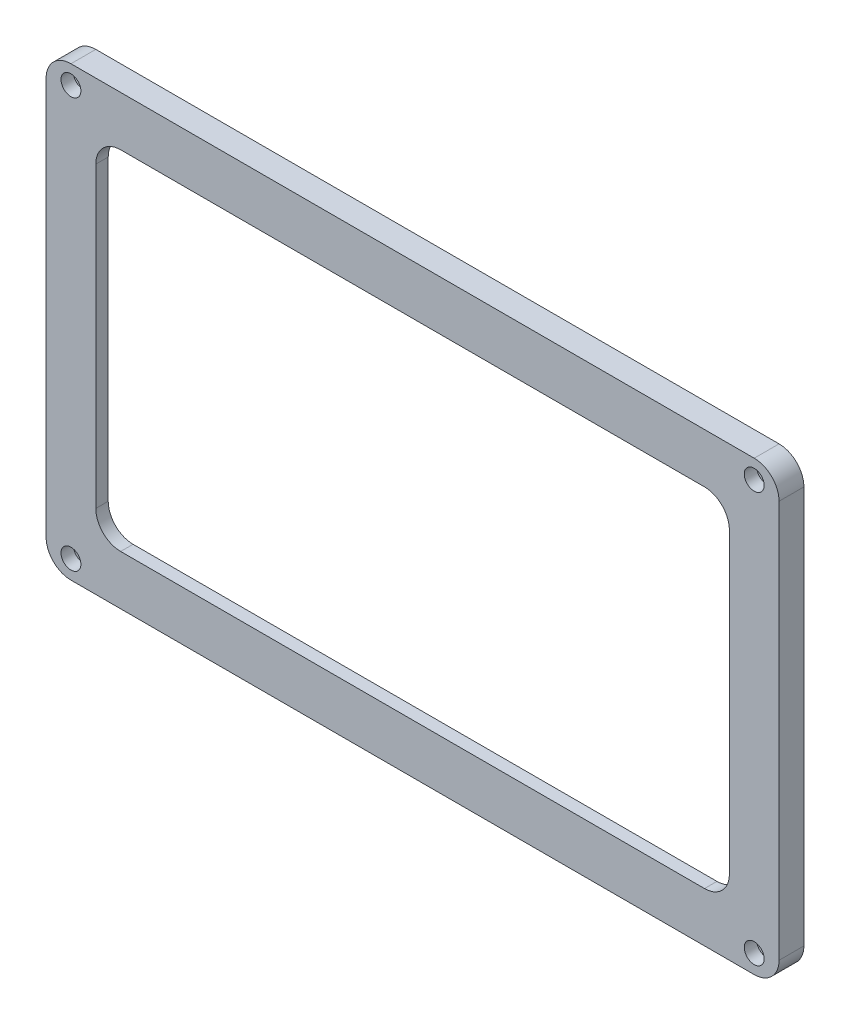
ISO-10303-21;
HEADER;
FILE_DESCRIPTION(('STEP AP214'),'2;1');
FILE_NAME('part.step','',(''),(''),'','','');
FILE_SCHEMA(('AUTOMOTIVE_DESIGN { 1 0 10303 214 1 1 1 1 }'));
ENDSEC;
DATA;
#1=APPLICATION_CONTEXT('core data for automotive mechanical design processes');
#2=APPLICATION_PROTOCOL_DEFINITION('international standard','automotive_design',2000,#1);
#3=PRODUCT_CONTEXT('',#1,'mechanical');
#4=PRODUCT('Part','Part','',(#3));
#5=PRODUCT_RELATED_PRODUCT_CATEGORY('part','',(#4));
#6=PRODUCT_DEFINITION_FORMATION('','',#4);
#7=PRODUCT_DEFINITION_CONTEXT('part definition',#1,'design');
#8=PRODUCT_DEFINITION('design','',#6,#7);
#9=PRODUCT_DEFINITION_SHAPE('','',#8);
#10=(LENGTH_UNIT() NAMED_UNIT(*) SI_UNIT(.MILLI.,.METRE.));
#11=(NAMED_UNIT(*) PLANE_ANGLE_UNIT() SI_UNIT($,.RADIAN.));
#12=(NAMED_UNIT(*) SI_UNIT($,.STERADIAN.) SOLID_ANGLE_UNIT());
#13=UNCERTAINTY_MEASURE_WITH_UNIT(LENGTH_MEASURE(1.E-05),#10,'distance_accuracy_value','');
#14=(GEOMETRIC_REPRESENTATION_CONTEXT(3) GLOBAL_UNCERTAINTY_ASSIGNED_CONTEXT((#13)) GLOBAL_UNIT_ASSIGNED_CONTEXT((#10,
#11,#12)) REPRESENTATION_CONTEXT('',''));
#15=CARTESIAN_POINT('',(0.,0.,0.));
#16=DIRECTION('',(0.,0.,1.));
#17=DIRECTION('',(1.,0.,0.));
#18=AXIS2_PLACEMENT_3D('',#15,#16,#17);
#19=CARTESIAN_POINT('',(29.5,-18.,3.));
#20=DIRECTION('',(-1.,0.,0.));
#21=DIRECTION('',(0.,0.,1.));
#22=AXIS2_PLACEMENT_3D('',#19,#20,#21);
#23=PLANE('',#22);
#24=DIRECTION('',(0.,0.,-1.));
#25=VECTOR('',#24,1.);
#26=CARTESIAN_POINT('',(29.5,-16.,3.));
#27=LINE('',#26,#25);
#28=CARTESIAN_POINT('',(29.5,-16.,3.));
#29=VERTEX_POINT('',#28);
#30=CARTESIAN_POINT('',(29.5,-16.,1.));
#31=VERTEX_POINT('',#30);
#32=EDGE_CURVE('E243',#29,#31,#27,.T.);
#33=ORIENTED_EDGE('',*,*,#32,.T.);
#34=DIRECTION('',(0.,1.,0.));
#35=VECTOR('',#34,1.);
#36=CARTESIAN_POINT('',(29.5,-18.,1.));
#37=LINE('',#36,#35);
#38=CARTESIAN_POINT('',(29.5,16.,1.));
#39=VERTEX_POINT('',#38);
#40=EDGE_CURVE('E356',#31,#39,#37,.T.);
#41=ORIENTED_EDGE('',*,*,#40,.T.);
#42=DIRECTION('',(0.,0.,-1.));
#43=VECTOR('',#42,1.);
#44=CARTESIAN_POINT('',(29.5,16.,3.));
#45=LINE('',#44,#43);
#46=CARTESIAN_POINT('',(29.5,16.,3.));
#47=VERTEX_POINT('',#46);
#48=EDGE_CURVE('E246',#39,#47,#45,.F.);
#49=ORIENTED_EDGE('',*,*,#48,.T.);
#50=DIRECTION('',(0.,1.,0.));
#51=VECTOR('',#50,1.);
#52=CARTESIAN_POINT('',(29.5,-18.,3.));
#53=LINE('',#52,#51);
#54=EDGE_CURVE('E396',#29,#47,#53,.T.);
#55=ORIENTED_EDGE('',*,*,#54,.F.);
#56=EDGE_LOOP('',(#33,#41,#49,#55));
#57=FACE_BOUND('',#56,.T.);
#58=ADVANCED_FACE('F35',(#57),#23,.F.);
#59=CARTESIAN_POINT('',(-29.5,18.,3.));
#60=DIRECTION('',(0.,-1.,0.));
#61=DIRECTION('',(0.,0.,-1.));
#62=AXIS2_PLACEMENT_3D('',#59,#60,#61);
#63=PLANE('',#62);
#64=DIRECTION('',(0.,0.,-1.));
#65=VECTOR('',#64,1.);
#66=CARTESIAN_POINT('',(27.5,18.,3.));
#67=LINE('',#66,#65);
#68=CARTESIAN_POINT('',(27.5,18.,3.));
#69=VERTEX_POINT('',#68);
#70=CARTESIAN_POINT('',(27.5,18.,1.));
#71=VERTEX_POINT('',#70);
#72=EDGE_CURVE('E225',#69,#71,#67,.T.);
#73=ORIENTED_EDGE('',*,*,#72,.T.);
#74=DIRECTION('',(-1.,0.,0.));
#75=VECTOR('',#74,1.);
#76=CARTESIAN_POINT('',(-29.5,18.,1.));
#77=LINE('',#76,#75);
#78=CARTESIAN_POINT('',(-27.5,18.,1.));
#79=VERTEX_POINT('',#78);
#80=EDGE_CURVE('E353',#71,#79,#77,.T.);
#81=ORIENTED_EDGE('',*,*,#80,.T.);
#82=DIRECTION('',(0.,0.,-1.));
#83=VECTOR('',#82,1.);
#84=CARTESIAN_POINT('',(-27.5,18.,3.));
#85=LINE('',#84,#83);
#86=CARTESIAN_POINT('',(-27.5,18.,3.));
#87=VERTEX_POINT('',#86);
#88=EDGE_CURVE('E234',#79,#87,#85,.F.);
#89=ORIENTED_EDGE('',*,*,#88,.T.);
#90=DIRECTION('',(-1.,0.,0.));
#91=VECTOR('',#90,1.);
#92=CARTESIAN_POINT('',(-29.5,18.,3.));
#93=LINE('',#92,#91);
#94=EDGE_CURVE('E399',#69,#87,#93,.T.);
#95=ORIENTED_EDGE('',*,*,#94,.F.);
#96=EDGE_LOOP('',(#73,#81,#89,#95));
#97=FACE_BOUND('',#96,.T.);
#98=ADVANCED_FACE('F465',(#97),#63,.F.);
#99=CARTESIAN_POINT('',(-29.5,-18.,3.));
#100=DIRECTION('',(1.,0.,0.));
#101=DIRECTION('',(0.,0.,-1.));
#102=AXIS2_PLACEMENT_3D('',#99,#100,#101);
#103=PLANE('',#102);
#104=DIRECTION('',(0.,0.,-1.));
#105=VECTOR('',#104,1.);
#106=CARTESIAN_POINT('',(-29.5,16.,3.));
#107=LINE('',#106,#105);
#108=CARTESIAN_POINT('',(-29.5,16.,3.));
#109=VERTEX_POINT('',#108);
#110=CARTESIAN_POINT('',(-29.5,16.,1.));
#111=VERTEX_POINT('',#110);
#112=EDGE_CURVE('E217',#109,#111,#107,.T.);
#113=ORIENTED_EDGE('',*,*,#112,.T.);
#114=DIRECTION('',(0.,-1.,0.));
#115=VECTOR('',#114,1.);
#116=CARTESIAN_POINT('',(-29.5,-18.,1.));
#117=LINE('',#116,#115);
#118=CARTESIAN_POINT('',(-29.5,-16.,1.));
#119=VERTEX_POINT('',#118);
#120=EDGE_CURVE('E199',#111,#119,#117,.T.);
#121=ORIENTED_EDGE('',*,*,#120,.T.);
#122=DIRECTION('',(0.,0.,-1.));
#123=VECTOR('',#122,1.);
#124=CARTESIAN_POINT('',(-29.5,-16.,3.));
#125=LINE('',#124,#123);
#126=CARTESIAN_POINT('',(-29.5,-16.,3.));
#127=VERTEX_POINT('',#126);
#128=EDGE_CURVE('E214',#119,#127,#125,.F.);
#129=ORIENTED_EDGE('',*,*,#128,.T.);
#130=DIRECTION('',(0.,-1.,0.));
#131=VECTOR('',#130,1.);
#132=CARTESIAN_POINT('',(-29.5,-18.,3.));
#133=LINE('',#132,#131);
#134=EDGE_CURVE('E402',#109,#127,#133,.T.);
#135=ORIENTED_EDGE('',*,*,#134,.F.);
#136=EDGE_LOOP('',(#113,#121,#129,#135));
#137=FACE_BOUND('',#136,.T.);
#138=ADVANCED_FACE('F212',(#137),#103,.F.);
#139=CARTESIAN_POINT('',(-29.5,-18.,3.));
#140=DIRECTION('',(0.,1.,0.));
#141=DIRECTION('',(0.,0.,1.));
#142=AXIS2_PLACEMENT_3D('',#139,#140,#141);
#143=PLANE('',#142);
#144=DIRECTION('',(0.,0.,-1.));
#145=VECTOR('',#144,1.);
#146=CARTESIAN_POINT('',(-27.5,-18.,3.));
#147=LINE('',#146,#145);
#148=CARTESIAN_POINT('',(-27.5,-18.,3.));
#149=VERTEX_POINT('',#148);
#150=CARTESIAN_POINT('',(-27.5,-18.,1.));
#151=VERTEX_POINT('',#150);
#152=EDGE_CURVE('E248',#149,#151,#147,.T.);
#153=ORIENTED_EDGE('',*,*,#152,.T.);
#154=DIRECTION('',(1.,0.,0.));
#155=VECTOR('',#154,1.);
#156=CARTESIAN_POINT('',(-29.5,-18.,1.));
#157=LINE('',#156,#155);
#158=CARTESIAN_POINT('',(27.5,-18.,1.));
#159=VERTEX_POINT('',#158);
#160=EDGE_CURVE('E202',#151,#159,#157,.T.);
#161=ORIENTED_EDGE('',*,*,#160,.T.);
#162=DIRECTION('',(0.,0.,-1.));
#163=VECTOR('',#162,1.);
#164=CARTESIAN_POINT('',(27.5,-18.,3.));
#165=LINE('',#164,#163);
#166=CARTESIAN_POINT('',(27.5,-18.,3.));
#167=VERTEX_POINT('',#166);
#168=EDGE_CURVE('E250',#159,#167,#165,.F.);
#169=ORIENTED_EDGE('',*,*,#168,.T.);
#170=DIRECTION('',(1.,0.,0.));
#171=VECTOR('',#170,1.);
#172=CARTESIAN_POINT('',(-29.5,-18.,3.));
#173=LINE('',#172,#171);
#174=EDGE_CURVE('E404',#149,#167,#173,.T.);
#175=ORIENTED_EDGE('',*,*,#174,.F.);
#176=EDGE_LOOP('',(#153,#161,#169,#175));
#177=FACE_BOUND('',#176,.T.);
#178=ADVANCED_FACE('F619',(#177),#143,.F.);
#179=CARTESIAN_POINT('',(0.,0.,3.));
#180=DIRECTION('',(0.,0.,-1.));
#181=DIRECTION('',(-1.,0.,0.));
#182=AXIS2_PLACEMENT_3D('',#179,#180,#181);
#183=PLANE('',#182);
#184=CARTESIAN_POINT('',(-27.5,-16.5,3.));
#185=DIRECTION('',(0.,0.,1.));
#186=DIRECTION('',(1.,0.,0.));
#187=AXIS2_PLACEMENT_3D('',#184,#185,#186);
#188=CIRCLE('',#187,0.799999999999999);
#189=CARTESIAN_POINT('',(-26.7,-16.5,3.));
#190=VERTEX_POINT('',#189);
#191=EDGE_CURVE('E329',#190,#190,#188,.T.);
#192=ORIENTED_EDGE('',*,*,#191,.F.);
#193=EDGE_LOOP('',(#192));
#194=FACE_BOUND('',#193,.T.);
#195=CARTESIAN_POINT('',(27.5,-16.5,3.));
#196=DIRECTION('',(0.,0.,1.));
#197=DIRECTION('',(1.,0.,0.));
#198=AXIS2_PLACEMENT_3D('',#195,#196,#197);
#199=CIRCLE('',#198,0.799999999999999);
#200=CARTESIAN_POINT('',(28.3,-16.5,3.));
#201=VERTEX_POINT('',#200);
#202=EDGE_CURVE('E338',#201,#201,#199,.T.);
#203=ORIENTED_EDGE('',*,*,#202,.F.);
#204=EDGE_LOOP('',(#203));
#205=FACE_BOUND('',#204,.T.);
#206=CARTESIAN_POINT('',(27.5,16.5,3.));
#207=DIRECTION('',(0.,0.,1.));
#208=DIRECTION('',(1.,0.,0.));
#209=AXIS2_PLACEMENT_3D('',#206,#207,#208);
#210=CIRCLE('',#209,0.799999999999999);
#211=CARTESIAN_POINT('',(28.3,16.5,3.));
#212=VERTEX_POINT('',#211);
#213=EDGE_CURVE('E608',#212,#212,#210,.T.);
#214=ORIENTED_EDGE('',*,*,#213,.F.);
#215=EDGE_LOOP('',(#214));
#216=FACE_BOUND('',#215,.T.);
#217=CARTESIAN_POINT('',(-27.5,16.5,3.));
#218=DIRECTION('',(0.,0.,1.));
#219=DIRECTION('',(1.,0.,0.));
#220=AXIS2_PLACEMENT_3D('',#217,#218,#219);
#221=CIRCLE('',#220,0.799999999999999);
#222=CARTESIAN_POINT('',(-26.7,16.5,3.));
#223=VERTEX_POINT('',#222);
#224=EDGE_CURVE('E345',#223,#223,#221,.T.);
#225=ORIENTED_EDGE('',*,*,#224,.F.);
#226=EDGE_LOOP('',(#225));
#227=FACE_BOUND('',#226,.T.);
#228=DIRECTION('',(-1.,0.,0.));
#229=VECTOR('',#228,1.);
#230=CARTESIAN_POINT('',(-25.5,14.,3.));
#231=LINE('',#230,#229);
#232=CARTESIAN_POINT('',(23.5,14.,3.));
#233=VERTEX_POINT('',#232);
#234=CARTESIAN_POINT('',(-23.5,14.,3.));
#235=VERTEX_POINT('',#234);
#236=EDGE_CURVE('E375',#233,#235,#231,.T.);
#237=ORIENTED_EDGE('',*,*,#236,.F.);
#238=CARTESIAN_POINT('',(23.5,12.,3.));
#239=DIRECTION('',(0.,0.,-1.));
#240=DIRECTION('',(-1.,0.,0.));
#241=AXIS2_PLACEMENT_3D('',#238,#239,#240);
#242=CIRCLE('',#241,2.);
#243=CARTESIAN_POINT('',(25.5,12.,3.));
#244=VERTEX_POINT('',#243);
#245=EDGE_CURVE('E280',#233,#244,#242,.T.);
#246=ORIENTED_EDGE('',*,*,#245,.T.);
#247=DIRECTION('',(0.,1.,0.));
#248=VECTOR('',#247,1.);
#249=CARTESIAN_POINT('',(25.5,-14.,3.));
#250=LINE('',#249,#248);
#251=CARTESIAN_POINT('',(25.5,-12.,3.));
#252=VERTEX_POINT('',#251);
#253=EDGE_CURVE('E372',#252,#244,#250,.T.);
#254=ORIENTED_EDGE('',*,*,#253,.F.);
#255=CARTESIAN_POINT('',(23.5,-12.,3.));
#256=DIRECTION('',(0.,0.,-1.));
#257=DIRECTION('',(-1.,0.,0.));
#258=AXIS2_PLACEMENT_3D('',#255,#256,#257);
#259=CIRCLE('',#258,2.);
#260=CARTESIAN_POINT('',(23.5,-14.,3.));
#261=VERTEX_POINT('',#260);
#262=EDGE_CURVE('E276',#252,#261,#259,.T.);
#263=ORIENTED_EDGE('',*,*,#262,.T.);
#264=DIRECTION('',(1.,0.,0.));
#265=VECTOR('',#264,1.);
#266=CARTESIAN_POINT('',(-25.5,-14.,3.));
#267=LINE('',#266,#265);
#268=CARTESIAN_POINT('',(-23.5,-14.,3.));
#269=VERTEX_POINT('',#268);
#270=EDGE_CURVE('E381',#269,#261,#267,.T.);
#271=ORIENTED_EDGE('',*,*,#270,.F.);
#272=CARTESIAN_POINT('',(-23.5,-12.,3.));
#273=DIRECTION('',(0.,0.,-1.));
#274=DIRECTION('',(-1.,0.,0.));
#275=AXIS2_PLACEMENT_3D('',#272,#273,#274);
#276=CIRCLE('',#275,2.);
#277=CARTESIAN_POINT('',(-25.5,-12.,3.));
#278=VERTEX_POINT('',#277);
#279=EDGE_CURVE('E272',#269,#278,#276,.T.);
#280=ORIENTED_EDGE('',*,*,#279,.T.);
#281=DIRECTION('',(0.,-1.,0.));
#282=VECTOR('',#281,1.);
#283=CARTESIAN_POINT('',(-25.5,-14.,3.));
#284=LINE('',#283,#282);
#285=CARTESIAN_POINT('',(-25.5,12.,3.));
#286=VERTEX_POINT('',#285);
#287=EDGE_CURVE('E378',#286,#278,#284,.T.);
#288=ORIENTED_EDGE('',*,*,#287,.F.);
#289=CARTESIAN_POINT('',(-23.5,12.,3.));
#290=DIRECTION('',(0.,0.,-1.));
#291=DIRECTION('',(-1.,0.,0.));
#292=AXIS2_PLACEMENT_3D('',#289,#290,#291);
#293=CIRCLE('',#292,2.);
#294=EDGE_CURVE('E284',#286,#235,#293,.T.);
#295=ORIENTED_EDGE('',*,*,#294,.T.);
#296=EDGE_LOOP('',(#237,#246,#254,#263,#271,#280,#288,#295));
#297=FACE_BOUND('',#296,.T.);
#298=ORIENTED_EDGE('',*,*,#94,.T.);
#299=CARTESIAN_POINT('',(-27.5,16.,3.));
#300=DIRECTION('',(0.,0.,-1.));
#301=DIRECTION('',(-1.,0.,0.));
#302=AXIS2_PLACEMENT_3D('',#299,#300,#301);
#303=CIRCLE('',#302,2.);
#304=EDGE_CURVE('E241',#87,#109,#303,.F.);
#305=ORIENTED_EDGE('',*,*,#304,.T.);
#306=ORIENTED_EDGE('',*,*,#134,.T.);
#307=CARTESIAN_POINT('',(-27.5,-16.,3.));
#308=DIRECTION('',(0.,0.,-1.));
#309=DIRECTION('',(-1.,0.,0.));
#310=AXIS2_PLACEMENT_3D('',#307,#308,#309);
#311=CIRCLE('',#310,2.);
#312=EDGE_CURVE('E222',#127,#149,#311,.F.);
#313=ORIENTED_EDGE('',*,*,#312,.T.);
#314=ORIENTED_EDGE('',*,*,#174,.T.);
#315=CARTESIAN_POINT('',(27.5,-16.,3.));
#316=DIRECTION('',(0.,0.,-1.));
#317=DIRECTION('',(-1.,0.,0.));
#318=AXIS2_PLACEMENT_3D('',#315,#316,#317);
#319=CIRCLE('',#318,2.);
#320=EDGE_CURVE('E237',#167,#29,#319,.F.);
#321=ORIENTED_EDGE('',*,*,#320,.T.);
#322=ORIENTED_EDGE('',*,*,#54,.T.);
#323=CARTESIAN_POINT('',(27.5,16.,3.));
#324=DIRECTION('',(0.,0.,-1.));
#325=DIRECTION('',(-1.,0.,0.));
#326=AXIS2_PLACEMENT_3D('',#323,#324,#325);
#327=CIRCLE('',#326,2.);
#328=EDGE_CURVE('E239',#47,#69,#327,.F.);
#329=ORIENTED_EDGE('',*,*,#328,.T.);
#330=EDGE_LOOP('',(#298,#305,#306,#313,#314,#321,#322,#329));
#331=FACE_BOUND('',#330,.T.);
#332=ADVANCED_FACE('F432',(#194,#205,#216,#227,#297,#331),#183,.F.);
#333=CARTESIAN_POINT('',(-26.75,-15.25,2.));
#334=DIRECTION('',(-1.,0.,0.));
#335=DIRECTION('',(0.,0.,1.));
#336=AXIS2_PLACEMENT_3D('',#333,#334,#335);
#337=PLANE('',#336);
#338=DIRECTION('',(0.,1.,0.));
#339=VECTOR('',#338,1.);
#340=CARTESIAN_POINT('',(-26.75,-15.25,1.));
#341=LINE('',#340,#339);
#342=CARTESIAN_POINT('',(-26.75,-15.05,1.));
#343=VERTEX_POINT('',#342);
#344=CARTESIAN_POINT('',(-26.75,15.05,1.));
#345=VERTEX_POINT('',#344);
#346=EDGE_CURVE('E369',#343,#345,#341,.T.);
#347=ORIENTED_EDGE('',*,*,#346,.T.);
#348=DIRECTION('',(0.,0.,-1.));
#349=VECTOR('',#348,1.);
#350=CARTESIAN_POINT('',(-26.75,15.05,2.));
#351=LINE('',#350,#349);
#352=CARTESIAN_POINT('',(-26.75,15.05,2.));
#353=VERTEX_POINT('',#352);
#354=EDGE_CURVE('E307',#345,#353,#351,.F.);
#355=ORIENTED_EDGE('',*,*,#354,.T.);
#356=DIRECTION('',(0.,1.,0.));
#357=VECTOR('',#356,1.);
#358=CARTESIAN_POINT('',(-26.75,-15.25,2.));
#359=LINE('',#358,#357);
#360=CARTESIAN_POINT('',(-26.75,-15.05,2.));
#361=VERTEX_POINT('',#360);
#362=EDGE_CURVE('E384',#361,#353,#359,.T.);
#363=ORIENTED_EDGE('',*,*,#362,.F.);
#364=DIRECTION('',(0.,0.,-1.));
#365=VECTOR('',#364,1.);
#366=CARTESIAN_POINT('',(-26.75,-15.05,1.));
#367=LINE('',#366,#365);
#368=EDGE_CURVE('E304',#361,#343,#367,.T.);
#369=ORIENTED_EDGE('',*,*,#368,.T.);
#370=EDGE_LOOP('',(#347,#355,#363,#369));
#371=FACE_BOUND('',#370,.T.);
#372=ADVANCED_FACE('F518',(#371),#337,.F.);
#373=CARTESIAN_POINT('',(26.75,-15.25,2.));
#374=DIRECTION('',(0.,-1.,0.));
#375=DIRECTION('',(0.,0.,-1.));
#376=AXIS2_PLACEMENT_3D('',#373,#374,#375);
#377=PLANE('',#376);
#378=DIRECTION('',(-1.,0.,0.));
#379=VECTOR('',#378,1.);
#380=CARTESIAN_POINT('',(26.75,-15.25,1.));
#381=LINE('',#380,#379);
#382=CARTESIAN_POINT('',(26.55,-15.25,1.));
#383=VERTEX_POINT('',#382);
#384=CARTESIAN_POINT('',(-26.55,-15.25,1.));
#385=VERTEX_POINT('',#384);
#386=EDGE_CURVE('E367',#383,#385,#381,.T.);
#387=ORIENTED_EDGE('',*,*,#386,.T.);
#388=DIRECTION('',(0.,0.,-1.));
#389=VECTOR('',#388,1.);
#390=CARTESIAN_POINT('',(-26.55,-15.25,2.));
#391=LINE('',#390,#389);
#392=CARTESIAN_POINT('',(-26.55,-15.25,2.));
#393=VERTEX_POINT('',#392);
#394=EDGE_CURVE('E311',#385,#393,#391,.F.);
#395=ORIENTED_EDGE('',*,*,#394,.T.);
#396=DIRECTION('',(-1.,0.,0.));
#397=VECTOR('',#396,1.);
#398=CARTESIAN_POINT('',(26.75,-15.25,2.));
#399=LINE('',#398,#397);
#400=CARTESIAN_POINT('',(26.55,-15.25,2.));
#401=VERTEX_POINT('',#400);
#402=EDGE_CURVE('E393',#401,#393,#399,.T.);
#403=ORIENTED_EDGE('',*,*,#402,.F.);
#404=DIRECTION('',(0.,0.,-1.));
#405=VECTOR('',#404,1.);
#406=CARTESIAN_POINT('',(26.55,-15.25,1.));
#407=LINE('',#406,#405);
#408=EDGE_CURVE('E309',#401,#383,#407,.T.);
#409=ORIENTED_EDGE('',*,*,#408,.T.);
#410=EDGE_LOOP('',(#387,#395,#403,#409));
#411=FACE_BOUND('',#410,.T.);
#412=ADVANCED_FACE('F534',(#411),#377,.F.);
#413=CARTESIAN_POINT('',(26.75,-15.25,2.));
#414=DIRECTION('',(1.,0.,0.));
#415=DIRECTION('',(0.,0.,-1.));
#416=AXIS2_PLACEMENT_3D('',#413,#414,#415);
#417=PLANE('',#416);
#418=DIRECTION('',(0.,-1.,0.));
#419=VECTOR('',#418,1.);
#420=CARTESIAN_POINT('',(26.75,-15.25,2.));
#421=LINE('',#420,#419);
#422=CARTESIAN_POINT('',(26.75,15.05,2.));
#423=VERTEX_POINT('',#422);
#424=CARTESIAN_POINT('',(26.75,-15.05,2.));
#425=VERTEX_POINT('',#424);
#426=EDGE_CURVE('E390',#423,#425,#421,.T.);
#427=ORIENTED_EDGE('',*,*,#426,.F.);
#428=DIRECTION('',(0.,0.,-1.));
#429=VECTOR('',#428,1.);
#430=CARTESIAN_POINT('',(26.75,15.05,1.));
#431=LINE('',#430,#429);
#432=CARTESIAN_POINT('',(26.75,15.05,1.));
#433=VERTEX_POINT('',#432);
#434=EDGE_CURVE('E288',#423,#433,#431,.T.);
#435=ORIENTED_EDGE('',*,*,#434,.T.);
#436=DIRECTION('',(0.,-1.,0.));
#437=VECTOR('',#436,1.);
#438=CARTESIAN_POINT('',(26.75,-15.25,1.));
#439=LINE('',#438,#437);
#440=CARTESIAN_POINT('',(26.75,-15.05,1.));
#441=VERTEX_POINT('',#440);
#442=EDGE_CURVE('E364',#433,#441,#439,.T.);
#443=ORIENTED_EDGE('',*,*,#442,.T.);
#444=DIRECTION('',(0.,0.,-1.));
#445=VECTOR('',#444,1.);
#446=CARTESIAN_POINT('',(26.75,-15.05,2.));
#447=LINE('',#446,#445);
#448=EDGE_CURVE('E207',#441,#425,#447,.F.);
#449=ORIENTED_EDGE('',*,*,#448,.T.);
#450=EDGE_LOOP('',(#427,#435,#443,#449));
#451=FACE_BOUND('',#450,.T.);
#452=ADVANCED_FACE('F531',(#451),#417,.F.);
#453=CARTESIAN_POINT('',(26.75,15.25,2.));
#454=DIRECTION('',(0.,1.,0.));
#455=DIRECTION('',(0.,0.,1.));
#456=AXIS2_PLACEMENT_3D('',#453,#454,#455);
#457=PLANE('',#456);
#458=DIRECTION('',(1.,0.,0.));
#459=VECTOR('',#458,1.);
#460=CARTESIAN_POINT('',(26.75,15.25,1.));
#461=LINE('',#460,#459);
#462=CARTESIAN_POINT('',(-26.55,15.25,1.));
#463=VERTEX_POINT('',#462);
#464=CARTESIAN_POINT('',(26.55,15.25,1.));
#465=VERTEX_POINT('',#464);
#466=EDGE_CURVE('E361',#463,#465,#461,.T.);
#467=ORIENTED_EDGE('',*,*,#466,.T.);
#468=DIRECTION('',(0.,0.,-1.));
#469=VECTOR('',#468,1.);
#470=CARTESIAN_POINT('',(26.55,15.25,2.));
#471=LINE('',#470,#469);
#472=CARTESIAN_POINT('',(26.55,15.25,2.));
#473=VERTEX_POINT('',#472);
#474=EDGE_CURVE('E294',#465,#473,#471,.F.);
#475=ORIENTED_EDGE('',*,*,#474,.T.);
#476=DIRECTION('',(1.,0.,0.));
#477=VECTOR('',#476,1.);
#478=CARTESIAN_POINT('',(26.75,15.25,2.));
#479=LINE('',#478,#477);
#480=CARTESIAN_POINT('',(-26.55,15.25,2.));
#481=VERTEX_POINT('',#480);
#482=EDGE_CURVE('E387',#481,#473,#479,.T.);
#483=ORIENTED_EDGE('',*,*,#482,.F.);
#484=DIRECTION('',(0.,0.,-1.));
#485=VECTOR('',#484,1.);
#486=CARTESIAN_POINT('',(-26.55,15.25,1.));
#487=LINE('',#486,#485);
#488=EDGE_CURVE('E291',#481,#463,#487,.T.);
#489=ORIENTED_EDGE('',*,*,#488,.T.);
#490=EDGE_LOOP('',(#467,#475,#483,#489));
#491=FACE_BOUND('',#490,.T.);
#492=ADVANCED_FACE('F524',(#491),#457,.F.);
#493=CARTESIAN_POINT('',(0.,0.,2.));
#494=DIRECTION('',(0.,0.,1.));
#495=DIRECTION('',(1.,0.,0.));
#496=AXIS2_PLACEMENT_3D('',#493,#494,#495);
#497=PLANE('',#496);
#498=DIRECTION('',(0.,-1.,0.));
#499=VECTOR('',#498,1.);
#500=CARTESIAN_POINT('',(-25.5,0.,2.));
#501=LINE('',#500,#499);
#502=CARTESIAN_POINT('',(-25.5,12.,2.));
#503=VERTEX_POINT('',#502);
#504=CARTESIAN_POINT('',(-25.5,-12.,2.));
#505=VERTEX_POINT('',#504);
#506=EDGE_CURVE('E410',#503,#505,#501,.T.);
#507=ORIENTED_EDGE('',*,*,#506,.T.);
#508=CARTESIAN_POINT('',(-23.5,-12.,2.));
#509=DIRECTION('',(0.,0.,1.));
#510=DIRECTION('',(1.,0.,0.));
#511=AXIS2_PLACEMENT_3D('',#508,#509,#510);
#512=CIRCLE('',#511,2.);
#513=CARTESIAN_POINT('',(-23.5,-14.,2.));
#514=VERTEX_POINT('',#513);
#515=EDGE_CURVE('E274',#505,#514,#512,.T.);
#516=ORIENTED_EDGE('',*,*,#515,.T.);
#517=DIRECTION('',(1.,0.,0.));
#518=VECTOR('',#517,1.);
#519=CARTESIAN_POINT('',(0.,-14.,2.));
#520=LINE('',#519,#518);
#521=CARTESIAN_POINT('',(23.5,-14.,2.));
#522=VERTEX_POINT('',#521);
#523=EDGE_CURVE('E228',#514,#522,#520,.T.);
#524=ORIENTED_EDGE('',*,*,#523,.T.);
#525=CARTESIAN_POINT('',(23.5,-12.,2.));
#526=DIRECTION('',(0.,0.,1.));
#527=DIRECTION('',(1.,0.,0.));
#528=AXIS2_PLACEMENT_3D('',#525,#526,#527);
#529=CIRCLE('',#528,2.);
#530=CARTESIAN_POINT('',(25.5,-12.,2.));
#531=VERTEX_POINT('',#530);
#532=EDGE_CURVE('E278',#522,#531,#529,.T.);
#533=ORIENTED_EDGE('',*,*,#532,.T.);
#534=DIRECTION('',(0.,1.,0.));
#535=VECTOR('',#534,1.);
#536=CARTESIAN_POINT('',(25.5,0.,2.));
#537=LINE('',#536,#535);
#538=CARTESIAN_POINT('',(25.5,12.,2.));
#539=VERTEX_POINT('',#538);
#540=EDGE_CURVE('E223',#531,#539,#537,.T.);
#541=ORIENTED_EDGE('',*,*,#540,.T.);
#542=CARTESIAN_POINT('',(23.5,12.,2.));
#543=DIRECTION('',(0.,0.,1.));
#544=DIRECTION('',(1.,0.,0.));
#545=AXIS2_PLACEMENT_3D('',#542,#543,#544);
#546=CIRCLE('',#545,2.);
#547=CARTESIAN_POINT('',(23.5,14.,2.));
#548=VERTEX_POINT('',#547);
#549=EDGE_CURVE('E282',#539,#548,#546,.T.);
#550=ORIENTED_EDGE('',*,*,#549,.T.);
#551=DIRECTION('',(-1.,0.,0.));
#552=VECTOR('',#551,1.);
#553=CARTESIAN_POINT('',(0.,14.,2.));
#554=LINE('',#553,#552);
#555=CARTESIAN_POINT('',(-23.5,14.,2.));
#556=VERTEX_POINT('',#555);
#557=EDGE_CURVE('E407',#548,#556,#554,.T.);
#558=ORIENTED_EDGE('',*,*,#557,.T.);
#559=CARTESIAN_POINT('',(-23.5,12.,2.));
#560=DIRECTION('',(0.,0.,1.));
#561=DIRECTION('',(1.,0.,0.));
#562=AXIS2_PLACEMENT_3D('',#559,#560,#561);
#563=CIRCLE('',#562,2.);
#564=EDGE_CURVE('E208',#556,#503,#563,.T.);
#565=ORIENTED_EDGE('',*,*,#564,.T.);
#566=EDGE_LOOP('',(#507,#516,#524,#533,#541,#550,#558,#565));
#567=FACE_BOUND('',#566,.T.);
#568=ORIENTED_EDGE('',*,*,#482,.T.);
#569=CARTESIAN_POINT('',(26.55,15.05,2.));
#570=DIRECTION('',(0.,0.,1.));
#571=DIRECTION('',(1.,0.,0.));
#572=AXIS2_PLACEMENT_3D('',#569,#570,#571);
#573=CIRCLE('',#572,0.2);
#574=EDGE_CURVE('E302',#473,#423,#573,.F.);
#575=ORIENTED_EDGE('',*,*,#574,.T.);
#576=ORIENTED_EDGE('',*,*,#426,.T.);
#577=CARTESIAN_POINT('',(26.55,-15.05,2.));
#578=DIRECTION('',(0.,0.,1.));
#579=DIRECTION('',(1.,0.,0.));
#580=AXIS2_PLACEMENT_3D('',#577,#578,#579);
#581=CIRCLE('',#580,0.2);
#582=EDGE_CURVE('E296',#425,#401,#581,.F.);
#583=ORIENTED_EDGE('',*,*,#582,.T.);
#584=ORIENTED_EDGE('',*,*,#402,.T.);
#585=CARTESIAN_POINT('',(-26.55,-15.05,2.));
#586=DIRECTION('',(0.,0.,1.));
#587=DIRECTION('',(1.,0.,0.));
#588=AXIS2_PLACEMENT_3D('',#585,#586,#587);
#589=CIRCLE('',#588,0.2);
#590=EDGE_CURVE('E298',#393,#361,#589,.F.);
#591=ORIENTED_EDGE('',*,*,#590,.T.);
#592=ORIENTED_EDGE('',*,*,#362,.T.);
#593=CARTESIAN_POINT('',(-26.55,15.05,2.));
#594=DIRECTION('',(0.,0.,1.));
#595=DIRECTION('',(1.,0.,0.));
#596=AXIS2_PLACEMENT_3D('',#593,#594,#595);
#597=CIRCLE('',#596,0.2);
#598=EDGE_CURVE('E300',#353,#481,#597,.F.);
#599=ORIENTED_EDGE('',*,*,#598,.T.);
#600=EDGE_LOOP('',(#568,#575,#576,#583,#584,#591,#592,#599));
#601=FACE_BOUND('',#600,.T.);
#602=ADVANCED_FACE('F416',(#567,#601),#497,.F.);
#603=CARTESIAN_POINT('',(25.5,-14.,1.));
#604=DIRECTION('',(1.,0.,0.));
#605=DIRECTION('',(0.,0.,-1.));
#606=AXIS2_PLACEMENT_3D('',#603,#604,#605);
#607=PLANE('',#606);
#608=ORIENTED_EDGE('',*,*,#540,.F.);
#609=DIRECTION('',(0.,0.,1.));
#610=VECTOR('',#609,1.);
#611=CARTESIAN_POINT('',(25.5,-12.,3.));
#612=LINE('',#611,#610);
#613=EDGE_CURVE('E264',#531,#252,#612,.T.);
#614=ORIENTED_EDGE('',*,*,#613,.T.);
#615=ORIENTED_EDGE('',*,*,#253,.T.);
#616=DIRECTION('',(0.,0.,1.));
#617=VECTOR('',#616,1.);
#618=CARTESIAN_POINT('',(25.5,12.,2.));
#619=LINE('',#618,#617);
#620=EDGE_CURVE('E262',#244,#539,#619,.F.);
#621=ORIENTED_EDGE('',*,*,#620,.T.);
#622=EDGE_LOOP('',(#608,#614,#615,#621));
#623=FACE_BOUND('',#622,.T.);
#624=ADVANCED_FACE('F428',(#623),#607,.F.);
#625=CARTESIAN_POINT('',(-25.5,-14.,1.));
#626=DIRECTION('',(0.,-1.,0.));
#627=DIRECTION('',(0.,0.,-1.));
#628=AXIS2_PLACEMENT_3D('',#625,#626,#627);
#629=PLANE('',#628);
#630=ORIENTED_EDGE('',*,*,#523,.F.);
#631=DIRECTION('',(0.,0.,1.));
#632=VECTOR('',#631,1.);
#633=CARTESIAN_POINT('',(-23.5,-14.,3.));
#634=LINE('',#633,#632);
#635=EDGE_CURVE('E254',#514,#269,#634,.T.);
#636=ORIENTED_EDGE('',*,*,#635,.T.);
#637=ORIENTED_EDGE('',*,*,#270,.T.);
#638=DIRECTION('',(0.,0.,1.));
#639=VECTOR('',#638,1.);
#640=CARTESIAN_POINT('',(23.5,-14.,2.));
#641=LINE('',#640,#639);
#642=EDGE_CURVE('E252',#261,#522,#641,.F.);
#643=ORIENTED_EDGE('',*,*,#642,.T.);
#644=EDGE_LOOP('',(#630,#636,#637,#643));
#645=FACE_BOUND('',#644,.T.);
#646=ADVANCED_FACE('F454',(#645),#629,.F.);
#647=CARTESIAN_POINT('',(-25.5,-14.,1.));
#648=DIRECTION('',(-1.,0.,0.));
#649=DIRECTION('',(0.,0.,1.));
#650=AXIS2_PLACEMENT_3D('',#647,#648,#649);
#651=PLANE('',#650);
#652=ORIENTED_EDGE('',*,*,#287,.T.);
#653=DIRECTION('',(0.,0.,1.));
#654=VECTOR('',#653,1.);
#655=CARTESIAN_POINT('',(-25.5,-12.,2.));
#656=LINE('',#655,#654);
#657=EDGE_CURVE('E260',#278,#505,#656,.F.);
#658=ORIENTED_EDGE('',*,*,#657,.T.);
#659=ORIENTED_EDGE('',*,*,#506,.F.);
#660=DIRECTION('',(0.,0.,1.));
#661=VECTOR('',#660,1.);
#662=CARTESIAN_POINT('',(-25.5,12.,3.));
#663=LINE('',#662,#661);
#664=EDGE_CURVE('E257',#503,#286,#663,.T.);
#665=ORIENTED_EDGE('',*,*,#664,.T.);
#666=EDGE_LOOP('',(#652,#658,#659,#665));
#667=FACE_BOUND('',#666,.T.);
#668=ADVANCED_FACE('F450',(#667),#651,.F.);
#669=CARTESIAN_POINT('',(-25.5,14.,1.));
#670=DIRECTION('',(0.,1.,0.));
#671=DIRECTION('',(0.,0.,1.));
#672=AXIS2_PLACEMENT_3D('',#669,#670,#671);
#673=PLANE('',#672);
#674=ORIENTED_EDGE('',*,*,#557,.F.);
#675=DIRECTION('',(0.,0.,1.));
#676=VECTOR('',#675,1.);
#677=CARTESIAN_POINT('',(23.5,14.,3.));
#678=LINE('',#677,#676);
#679=EDGE_CURVE('E269',#548,#233,#678,.T.);
#680=ORIENTED_EDGE('',*,*,#679,.T.);
#681=ORIENTED_EDGE('',*,*,#236,.T.);
#682=DIRECTION('',(0.,0.,1.));
#683=VECTOR('',#682,1.);
#684=CARTESIAN_POINT('',(-23.5,14.,2.));
#685=LINE('',#684,#683);
#686=EDGE_CURVE('E267',#235,#556,#685,.F.);
#687=ORIENTED_EDGE('',*,*,#686,.T.);
#688=EDGE_LOOP('',(#674,#680,#681,#687));
#689=FACE_BOUND('',#688,.T.);
#690=ADVANCED_FACE('F441',(#689),#673,.F.);
#691=CARTESIAN_POINT('',(-27.5,16.,3.));
#692=DIRECTION('',(0.,0.,-1.));
#693=DIRECTION('',(-1.,0.,0.));
#694=AXIS2_PLACEMENT_3D('',#691,#692,#693);
#695=CYLINDRICAL_SURFACE('',#694,2.);
#696=CARTESIAN_POINT('',(-27.5,16.,1.));
#697=DIRECTION('',(0.,0.,1.));
#698=DIRECTION('',(1.,0.,0.));
#699=AXIS2_PLACEMENT_3D('',#696,#697,#698);
#700=CIRCLE('',#699,2.);
#701=EDGE_CURVE('E351',#111,#79,#700,.F.);
#702=ORIENTED_EDGE('',*,*,#701,.F.);
#703=ORIENTED_EDGE('',*,*,#112,.F.);
#704=ORIENTED_EDGE('',*,*,#304,.F.);
#705=ORIENTED_EDGE('',*,*,#88,.F.);
#706=EDGE_LOOP('',(#702,#703,#704,#705));
#707=FACE_BOUND('',#706,.T.);
#708=ADVANCED_FACE('F475',(#707),#695,.T.);
#709=CARTESIAN_POINT('',(27.5,16.,3.));
#710=DIRECTION('',(0.,0.,-1.));
#711=DIRECTION('',(-1.,0.,0.));
#712=AXIS2_PLACEMENT_3D('',#709,#710,#711);
#713=CYLINDRICAL_SURFACE('',#712,2.);
#714=CARTESIAN_POINT('',(27.5,16.,1.));
#715=DIRECTION('',(0.,0.,1.));
#716=DIRECTION('',(1.,0.,0.));
#717=AXIS2_PLACEMENT_3D('',#714,#715,#716);
#718=CIRCLE('',#717,2.);
#719=EDGE_CURVE('E359',#71,#39,#718,.F.);
#720=ORIENTED_EDGE('',*,*,#719,.F.);
#721=ORIENTED_EDGE('',*,*,#72,.F.);
#722=ORIENTED_EDGE('',*,*,#328,.F.);
#723=ORIENTED_EDGE('',*,*,#48,.F.);
#724=EDGE_LOOP('',(#720,#721,#722,#723));
#725=FACE_BOUND('',#724,.T.);
#726=ADVANCED_FACE('F478',(#725),#713,.T.);
#727=CARTESIAN_POINT('',(27.5,-16.,3.));
#728=DIRECTION('',(0.,0.,-1.));
#729=DIRECTION('',(-1.,0.,0.));
#730=AXIS2_PLACEMENT_3D('',#727,#728,#729);
#731=CYLINDRICAL_SURFACE('',#730,2.);
#732=CARTESIAN_POINT('',(27.5,-16.,1.));
#733=DIRECTION('',(0.,0.,1.));
#734=DIRECTION('',(1.,0.,0.));
#735=AXIS2_PLACEMENT_3D('',#732,#733,#734);
#736=CIRCLE('',#735,2.);
#737=EDGE_CURVE('E218',#31,#159,#736,.F.);
#738=ORIENTED_EDGE('',*,*,#737,.F.);
#739=ORIENTED_EDGE('',*,*,#32,.F.);
#740=ORIENTED_EDGE('',*,*,#320,.F.);
#741=ORIENTED_EDGE('',*,*,#168,.F.);
#742=EDGE_LOOP('',(#738,#739,#740,#741));
#743=FACE_BOUND('',#742,.T.);
#744=ADVANCED_FACE('F482',(#743),#731,.T.);
#745=CARTESIAN_POINT('',(-27.5,-16.,3.));
#746=DIRECTION('',(0.,0.,-1.));
#747=DIRECTION('',(-1.,0.,0.));
#748=AXIS2_PLACEMENT_3D('',#745,#746,#747);
#749=CYLINDRICAL_SURFACE('',#748,2.);
#750=CARTESIAN_POINT('',(-27.5,-16.,1.));
#751=DIRECTION('',(0.,0.,1.));
#752=DIRECTION('',(1.,0.,0.));
#753=AXIS2_PLACEMENT_3D('',#750,#751,#752);
#754=CIRCLE('',#753,2.);
#755=EDGE_CURVE('E196',#151,#119,#754,.F.);
#756=ORIENTED_EDGE('',*,*,#755,.F.);
#757=ORIENTED_EDGE('',*,*,#152,.F.);
#758=ORIENTED_EDGE('',*,*,#312,.F.);
#759=ORIENTED_EDGE('',*,*,#128,.F.);
#760=EDGE_LOOP('',(#756,#757,#758,#759));
#761=FACE_BOUND('',#760,.T.);
#762=ADVANCED_FACE('F221',(#761),#749,.T.);
#763=CARTESIAN_POINT('',(-23.5,-12.,1.));
#764=DIRECTION('',(0.,0.,-1.));
#765=DIRECTION('',(-1.,0.,0.));
#766=AXIS2_PLACEMENT_3D('',#763,#764,#765);
#767=CYLINDRICAL_SURFACE('',#766,2.);
#768=ORIENTED_EDGE('',*,*,#515,.F.);
#769=ORIENTED_EDGE('',*,*,#657,.F.);
#770=ORIENTED_EDGE('',*,*,#279,.F.);
#771=ORIENTED_EDGE('',*,*,#635,.F.);
#772=EDGE_LOOP('',(#768,#769,#770,#771));
#773=FACE_BOUND('',#772,.T.);
#774=ADVANCED_FACE('F453',(#773),#767,.F.);
#775=CARTESIAN_POINT('',(23.5,-12.,1.));
#776=DIRECTION('',(0.,0.,-1.));
#777=DIRECTION('',(-1.,0.,0.));
#778=AXIS2_PLACEMENT_3D('',#775,#776,#777);
#779=CYLINDRICAL_SURFACE('',#778,2.);
#780=ORIENTED_EDGE('',*,*,#532,.F.);
#781=ORIENTED_EDGE('',*,*,#642,.F.);
#782=ORIENTED_EDGE('',*,*,#262,.F.);
#783=ORIENTED_EDGE('',*,*,#613,.F.);
#784=EDGE_LOOP('',(#780,#781,#782,#783));
#785=FACE_BOUND('',#784,.T.);
#786=ADVANCED_FACE('F425',(#785),#779,.F.);
#787=CARTESIAN_POINT('',(23.5,12.,1.));
#788=DIRECTION('',(0.,0.,-1.));
#789=DIRECTION('',(-1.,0.,0.));
#790=AXIS2_PLACEMENT_3D('',#787,#788,#789);
#791=CYLINDRICAL_SURFACE('',#790,2.);
#792=ORIENTED_EDGE('',*,*,#549,.F.);
#793=ORIENTED_EDGE('',*,*,#620,.F.);
#794=ORIENTED_EDGE('',*,*,#245,.F.);
#795=ORIENTED_EDGE('',*,*,#679,.F.);
#796=EDGE_LOOP('',(#792,#793,#794,#795));
#797=FACE_BOUND('',#796,.T.);
#798=ADVANCED_FACE('F438',(#797),#791,.F.);
#799=CARTESIAN_POINT('',(-23.5,12.,1.));
#800=DIRECTION('',(0.,0.,-1.));
#801=DIRECTION('',(-1.,0.,0.));
#802=AXIS2_PLACEMENT_3D('',#799,#800,#801);
#803=CYLINDRICAL_SURFACE('',#802,2.);
#804=ORIENTED_EDGE('',*,*,#564,.F.);
#805=ORIENTED_EDGE('',*,*,#686,.F.);
#806=ORIENTED_EDGE('',*,*,#294,.F.);
#807=ORIENTED_EDGE('',*,*,#664,.F.);
#808=EDGE_LOOP('',(#804,#805,#806,#807));
#809=FACE_BOUND('',#808,.T.);
#810=ADVANCED_FACE('F447',(#809),#803,.F.);
#811=CARTESIAN_POINT('',(0.,0.,1.));
#812=DIRECTION('',(0.,0.,1.));
#813=DIRECTION('',(1.,0.,0.));
#814=AXIS2_PLACEMENT_3D('',#811,#812,#813);
#815=PLANE('',#814);
#816=CARTESIAN_POINT('',(-27.5,-16.5,1.));
#817=DIRECTION('',(0.,0.,1.));
#818=DIRECTION('',(1.,0.,0.));
#819=AXIS2_PLACEMENT_3D('',#816,#817,#818);
#820=CIRCLE('',#819,0.6);
#821=CARTESIAN_POINT('',(-26.9,-16.5,1.));
#822=VERTEX_POINT('',#821);
#823=EDGE_CURVE('E39',#822,#822,#820,.T.);
#824=ORIENTED_EDGE('',*,*,#823,.T.);
#825=EDGE_LOOP('',(#824));
#826=FACE_BOUND('',#825,.T.);
#827=CARTESIAN_POINT('',(27.5,-16.5,1.));
#828=DIRECTION('',(0.,0.,1.));
#829=DIRECTION('',(1.,0.,0.));
#830=AXIS2_PLACEMENT_3D('',#827,#828,#829);
#831=CIRCLE('',#830,0.6);
#832=CARTESIAN_POINT('',(28.1,-16.5,1.));
#833=VERTEX_POINT('',#832);
#834=EDGE_CURVE('E324',#833,#833,#831,.T.);
#835=ORIENTED_EDGE('',*,*,#834,.T.);
#836=EDGE_LOOP('',(#835));
#837=FACE_BOUND('',#836,.T.);
#838=CARTESIAN_POINT('',(27.5,16.5,1.));
#839=DIRECTION('',(0.,0.,1.));
#840=DIRECTION('',(1.,0.,0.));
#841=AXIS2_PLACEMENT_3D('',#838,#839,#840);
#842=CIRCLE('',#841,0.6);
#843=CARTESIAN_POINT('',(28.1,16.5,1.));
#844=VERTEX_POINT('',#843);
#845=EDGE_CURVE('E321',#844,#844,#842,.T.);
#846=ORIENTED_EDGE('',*,*,#845,.T.);
#847=EDGE_LOOP('',(#846));
#848=FACE_BOUND('',#847,.T.);
#849=CARTESIAN_POINT('',(-27.5,16.5,1.));
#850=DIRECTION('',(0.,0.,1.));
#851=DIRECTION('',(1.,0.,0.));
#852=AXIS2_PLACEMENT_3D('',#849,#850,#851);
#853=CIRCLE('',#852,0.6);
#854=CARTESIAN_POINT('',(-26.9,16.5,1.));
#855=VERTEX_POINT('',#854);
#856=EDGE_CURVE('E318',#855,#855,#853,.T.);
#857=ORIENTED_EDGE('',*,*,#856,.T.);
#858=EDGE_LOOP('',(#857));
#859=FACE_BOUND('',#858,.T.);
#860=ORIENTED_EDGE('',*,*,#719,.T.);
#861=ORIENTED_EDGE('',*,*,#40,.F.);
#862=ORIENTED_EDGE('',*,*,#737,.T.);
#863=ORIENTED_EDGE('',*,*,#160,.F.);
#864=ORIENTED_EDGE('',*,*,#755,.T.);
#865=ORIENTED_EDGE('',*,*,#120,.F.);
#866=ORIENTED_EDGE('',*,*,#701,.T.);
#867=ORIENTED_EDGE('',*,*,#80,.F.);
#868=EDGE_LOOP('',(#860,#861,#862,#863,#864,#865,#866,#867));
#869=FACE_BOUND('',#868,.T.);
#870=ORIENTED_EDGE('',*,*,#386,.F.);
#871=CARTESIAN_POINT('',(26.55,-15.05,1.));
#872=DIRECTION('',(0.,0.,1.));
#873=DIRECTION('',(1.,0.,0.));
#874=AXIS2_PLACEMENT_3D('',#871,#872,#873);
#875=CIRCLE('',#874,0.2);
#876=EDGE_CURVE('E11',#383,#441,#875,.T.);
#877=ORIENTED_EDGE('',*,*,#876,.T.);
#878=ORIENTED_EDGE('',*,*,#442,.F.);
#879=CARTESIAN_POINT('',(26.55,15.05,1.));
#880=DIRECTION('',(0.,0.,1.));
#881=DIRECTION('',(1.,0.,0.));
#882=AXIS2_PLACEMENT_3D('',#879,#880,#881);
#883=CIRCLE('',#882,0.2);
#884=EDGE_CURVE('E313',#433,#465,#883,.T.);
#885=ORIENTED_EDGE('',*,*,#884,.T.);
#886=ORIENTED_EDGE('',*,*,#466,.F.);
#887=CARTESIAN_POINT('',(-26.55,15.05,1.));
#888=DIRECTION('',(0.,0.,1.));
#889=DIRECTION('',(1.,0.,0.));
#890=AXIS2_PLACEMENT_3D('',#887,#888,#889);
#891=CIRCLE('',#890,0.2);
#892=EDGE_CURVE('E315',#463,#345,#891,.T.);
#893=ORIENTED_EDGE('',*,*,#892,.T.);
#894=ORIENTED_EDGE('',*,*,#346,.F.);
#895=CARTESIAN_POINT('',(-26.55,-15.05,1.));
#896=DIRECTION('',(0.,0.,1.));
#897=DIRECTION('',(1.,0.,0.));
#898=AXIS2_PLACEMENT_3D('',#895,#896,#897);
#899=CIRCLE('',#898,0.2);
#900=EDGE_CURVE('E44',#343,#385,#899,.T.);
#901=ORIENTED_EDGE('',*,*,#900,.T.);
#902=EDGE_LOOP('',(#870,#877,#878,#885,#886,#893,#894,#901));
#903=FACE_BOUND('',#902,.T.);
#904=ADVANCED_FACE('F198',(#826,#837,#848,#859,#869,#903),#815,.F.);
#905=CARTESIAN_POINT('',(26.55,15.05,2.));
#906=DIRECTION('',(0.,0.,1.));
#907=DIRECTION('',(1.,0.,0.));
#908=AXIS2_PLACEMENT_3D('',#905,#906,#907);
#909=CYLINDRICAL_SURFACE('',#908,0.2);
#910=ORIENTED_EDGE('',*,*,#574,.F.);
#911=ORIENTED_EDGE('',*,*,#474,.F.);
#912=ORIENTED_EDGE('',*,*,#884,.F.);
#913=ORIENTED_EDGE('',*,*,#434,.F.);
#914=EDGE_LOOP('',(#910,#911,#912,#913));
#915=FACE_BOUND('',#914,.T.);
#916=ADVANCED_FACE('F497',(#915),#909,.F.);
#917=CARTESIAN_POINT('',(-26.55,15.05,2.));
#918=DIRECTION('',(0.,0.,1.));
#919=DIRECTION('',(1.,0.,0.));
#920=AXIS2_PLACEMENT_3D('',#917,#918,#919);
#921=CYLINDRICAL_SURFACE('',#920,0.2);
#922=ORIENTED_EDGE('',*,*,#598,.F.);
#923=ORIENTED_EDGE('',*,*,#354,.F.);
#924=ORIENTED_EDGE('',*,*,#892,.F.);
#925=ORIENTED_EDGE('',*,*,#488,.F.);
#926=EDGE_LOOP('',(#922,#923,#924,#925));
#927=FACE_BOUND('',#926,.T.);
#928=ADVANCED_FACE('F500',(#927),#921,.F.);
#929=CARTESIAN_POINT('',(-26.55,-15.05,2.));
#930=DIRECTION('',(0.,0.,1.));
#931=DIRECTION('',(1.,0.,0.));
#932=AXIS2_PLACEMENT_3D('',#929,#930,#931);
#933=CYLINDRICAL_SURFACE('',#932,0.2);
#934=ORIENTED_EDGE('',*,*,#590,.F.);
#935=ORIENTED_EDGE('',*,*,#394,.F.);
#936=ORIENTED_EDGE('',*,*,#900,.F.);
#937=ORIENTED_EDGE('',*,*,#368,.F.);
#938=EDGE_LOOP('',(#934,#935,#936,#937));
#939=FACE_BOUND('',#938,.T.);
#940=ADVANCED_FACE('F503',(#939),#933,.F.);
#941=CARTESIAN_POINT('',(26.55,-15.05,2.));
#942=DIRECTION('',(0.,0.,1.));
#943=DIRECTION('',(1.,0.,0.));
#944=AXIS2_PLACEMENT_3D('',#941,#942,#943);
#945=CYLINDRICAL_SURFACE('',#944,0.2);
#946=ORIENTED_EDGE('',*,*,#582,.F.);
#947=ORIENTED_EDGE('',*,*,#448,.F.);
#948=ORIENTED_EDGE('',*,*,#876,.F.);
#949=ORIENTED_EDGE('',*,*,#408,.F.);
#950=EDGE_LOOP('',(#946,#947,#948,#949));
#951=FACE_BOUND('',#950,.T.);
#952=ADVANCED_FACE('F37',(#951),#945,.F.);
#953=CARTESIAN_POINT('',(-27.5,16.5,2.));
#954=DIRECTION('',(0.,0.,1.));
#955=DIRECTION('',(1.,0.,0.));
#956=AXIS2_PLACEMENT_3D('',#953,#954,#955);
#957=CYLINDRICAL_SURFACE('',#956,0.799999999999999);
#958=CARTESIAN_POINT('',(-27.5,16.5,2.));
#959=DIRECTION('',(0.,0.,1.));
#960=DIRECTION('',(1.,0.,0.));
#961=AXIS2_PLACEMENT_3D('',#958,#959,#960);
#962=CIRCLE('',#961,0.799999999999999);
#963=CARTESIAN_POINT('',(-26.7,16.5,2.));
#964=VERTEX_POINT('',#963);
#965=EDGE_CURVE('E342',#964,#964,#962,.T.);
#966=ORIENTED_EDGE('',*,*,#965,.F.);
#967=EDGE_LOOP('',(#966));
#968=FACE_BOUND('',#967,.T.);
#969=ORIENTED_EDGE('',*,*,#224,.T.);
#970=EDGE_LOOP('',(#969));
#971=FACE_BOUND('',#970,.T.);
#972=ADVANCED_FACE('F510',(#968,#971),#957,.F.);
#973=CARTESIAN_POINT('',(-27.5,16.5,2.));
#974=DIRECTION('',(0.,0.,1.));
#975=DIRECTION('',(1.,0.,0.));
#976=AXIS2_PLACEMENT_3D('',#973,#974,#975);
#977=PLANE('',#976);
#978=CARTESIAN_POINT('',(-27.5,16.5,2.));
#979=DIRECTION('',(0.,0.,1.));
#980=DIRECTION('',(1.,0.,0.));
#981=AXIS2_PLACEMENT_3D('',#978,#979,#980);
#982=CIRCLE('',#981,0.6);
#983=CARTESIAN_POINT('',(-26.9,16.5,2.));
#984=VERTEX_POINT('',#983);
#985=EDGE_CURVE('E322',#984,#984,#982,.T.);
#986=ORIENTED_EDGE('',*,*,#985,.F.);
#987=EDGE_LOOP('',(#986));
#988=FACE_BOUND('',#987,.T.);
#989=ORIENTED_EDGE('',*,*,#965,.T.);
#990=EDGE_LOOP('',(#989));
#991=FACE_BOUND('',#990,.T.);
#992=ADVANCED_FACE('F541',(#988,#991),#977,.T.);
#993=CARTESIAN_POINT('',(27.5,16.5,2.));
#994=DIRECTION('',(0.,0.,1.));
#995=DIRECTION('',(1.,0.,0.));
#996=AXIS2_PLACEMENT_3D('',#993,#994,#995);
#997=CYLINDRICAL_SURFACE('',#996,0.799999999999999);
#998=CARTESIAN_POINT('',(27.5,16.5,2.));
#999=DIRECTION('',(0.,0.,1.));
#1000=DIRECTION('',(1.,0.,0.));
#1001=AXIS2_PLACEMENT_3D('',#998,#999,#1000);
#1002=CIRCLE('',#1001,0.799999999999999);
#1003=CARTESIAN_POINT('',(28.3,16.5,2.));
#1004=VERTEX_POINT('',#1003);
#1005=EDGE_CURVE('E348',#1004,#1004,#1002,.T.);
#1006=ORIENTED_EDGE('',*,*,#1005,.F.);
#1007=EDGE_LOOP('',(#1006));
#1008=FACE_BOUND('',#1007,.T.);
#1009=ORIENTED_EDGE('',*,*,#213,.T.);
#1010=EDGE_LOOP('',(#1009));
#1011=FACE_BOUND('',#1010,.T.);
#1012=ADVANCED_FACE('F545',(#1008,#1011),#997,.F.);
#1013=CARTESIAN_POINT('',(27.5,16.5,2.));
#1014=DIRECTION('',(0.,0.,1.));
#1015=DIRECTION('',(1.,0.,0.));
#1016=AXIS2_PLACEMENT_3D('',#1013,#1014,#1015);
#1017=PLANE('',#1016);
#1018=CARTESIAN_POINT('',(27.5,16.5,2.));
#1019=DIRECTION('',(0.,0.,1.));
#1020=DIRECTION('',(1.,0.,0.));
#1021=AXIS2_PLACEMENT_3D('',#1018,#1019,#1020);
#1022=CIRCLE('',#1021,0.6);
#1023=CARTESIAN_POINT('',(28.1,16.5,2.));
#1024=VERTEX_POINT('',#1023);
#1025=EDGE_CURVE('E590',#1024,#1024,#1022,.T.);
#1026=ORIENTED_EDGE('',*,*,#1025,.F.);
#1027=EDGE_LOOP('',(#1026));
#1028=FACE_BOUND('',#1027,.T.);
#1029=ORIENTED_EDGE('',*,*,#1005,.T.);
#1030=EDGE_LOOP('',(#1029));
#1031=FACE_BOUND('',#1030,.T.);
#1032=ADVANCED_FACE('F560',(#1028,#1031),#1017,.T.);
#1033=CARTESIAN_POINT('',(27.5,-16.5,2.));
#1034=DIRECTION('',(0.,0.,1.));
#1035=DIRECTION('',(1.,0.,0.));
#1036=AXIS2_PLACEMENT_3D('',#1033,#1034,#1035);
#1037=CYLINDRICAL_SURFACE('',#1036,0.799999999999999);
#1038=CARTESIAN_POINT('',(27.5,-16.5,2.));
#1039=DIRECTION('',(0.,0.,1.));
#1040=DIRECTION('',(1.,0.,0.));
#1041=AXIS2_PLACEMENT_3D('',#1038,#1039,#1040);
#1042=CIRCLE('',#1041,0.799999999999999);
#1043=CARTESIAN_POINT('',(28.3,-16.5,2.));
#1044=VERTEX_POINT('',#1043);
#1045=EDGE_CURVE('E611',#1044,#1044,#1042,.T.);
#1046=ORIENTED_EDGE('',*,*,#1045,.F.);
#1047=EDGE_LOOP('',(#1046));
#1048=FACE_BOUND('',#1047,.T.);
#1049=ORIENTED_EDGE('',*,*,#202,.T.);
#1050=EDGE_LOOP('',(#1049));
#1051=FACE_BOUND('',#1050,.T.);
#1052=ADVANCED_FACE('F557',(#1048,#1051),#1037,.F.);
#1053=CARTESIAN_POINT('',(27.5,-16.5,2.));
#1054=DIRECTION('',(0.,0.,1.));
#1055=DIRECTION('',(1.,0.,0.));
#1056=AXIS2_PLACEMENT_3D('',#1053,#1054,#1055);
#1057=PLANE('',#1056);
#1058=CARTESIAN_POINT('',(27.5,-16.5,2.));
#1059=DIRECTION('',(0.,0.,1.));
#1060=DIRECTION('',(1.,0.,0.));
#1061=AXIS2_PLACEMENT_3D('',#1058,#1059,#1060);
#1062=CIRCLE('',#1061,0.6);
#1063=CARTESIAN_POINT('',(28.1,-16.5,2.));
#1064=VERTEX_POINT('',#1063);
#1065=EDGE_CURVE('E596',#1064,#1064,#1062,.T.);
#1066=ORIENTED_EDGE('',*,*,#1065,.F.);
#1067=EDGE_LOOP('',(#1066));
#1068=FACE_BOUND('',#1067,.T.);
#1069=ORIENTED_EDGE('',*,*,#1045,.T.);
#1070=EDGE_LOOP('',(#1069));
#1071=FACE_BOUND('',#1070,.T.);
#1072=ADVANCED_FACE('F551',(#1068,#1071),#1057,.T.);
#1073=CARTESIAN_POINT('',(-27.5,-16.5,2.));
#1074=DIRECTION('',(0.,0.,1.));
#1075=DIRECTION('',(1.,0.,0.));
#1076=AXIS2_PLACEMENT_3D('',#1073,#1074,#1075);
#1077=CYLINDRICAL_SURFACE('',#1076,0.799999999999999);
#1078=CARTESIAN_POINT('',(-27.5,-16.5,2.));
#1079=DIRECTION('',(0.,0.,1.));
#1080=DIRECTION('',(1.,0.,0.));
#1081=AXIS2_PLACEMENT_3D('',#1078,#1079,#1080);
#1082=CIRCLE('',#1081,0.799999999999999);
#1083=CARTESIAN_POINT('',(-26.7,-16.5,2.));
#1084=VERTEX_POINT('',#1083);
#1085=EDGE_CURVE('E333',#1084,#1084,#1082,.T.);
#1086=ORIENTED_EDGE('',*,*,#1085,.F.);
#1087=EDGE_LOOP('',(#1086));
#1088=FACE_BOUND('',#1087,.T.);
#1089=ORIENTED_EDGE('',*,*,#191,.T.);
#1090=EDGE_LOOP('',(#1089));
#1091=FACE_BOUND('',#1090,.T.);
#1092=ADVANCED_FACE('F547',(#1088,#1091),#1077,.F.);
#1093=CARTESIAN_POINT('',(-27.5,-16.5,2.));
#1094=DIRECTION('',(0.,0.,1.));
#1095=DIRECTION('',(1.,0.,0.));
#1096=AXIS2_PLACEMENT_3D('',#1093,#1094,#1095);
#1097=PLANE('',#1096);
#1098=CARTESIAN_POINT('',(-27.5,-16.5,2.));
#1099=DIRECTION('',(0.,0.,1.));
#1100=DIRECTION('',(1.,0.,0.));
#1101=AXIS2_PLACEMENT_3D('',#1098,#1099,#1100);
#1102=CIRCLE('',#1101,0.6);
#1103=CARTESIAN_POINT('',(-26.9,-16.5,2.));
#1104=VERTEX_POINT('',#1103);
#1105=EDGE_CURVE('E601',#1104,#1104,#1102,.T.);
#1106=ORIENTED_EDGE('',*,*,#1105,.F.);
#1107=EDGE_LOOP('',(#1106));
#1108=FACE_BOUND('',#1107,.T.);
#1109=ORIENTED_EDGE('',*,*,#1085,.T.);
#1110=EDGE_LOOP('',(#1109));
#1111=FACE_BOUND('',#1110,.T.);
#1112=ADVANCED_FACE('F550',(#1108,#1111),#1097,.T.);
#1113=CARTESIAN_POINT('',(-27.5,16.5,-18.5));
#1114=DIRECTION('',(0.,0.,1.));
#1115=DIRECTION('',(1.,0.,0.));
#1116=AXIS2_PLACEMENT_3D('',#1113,#1114,#1115);
#1117=CYLINDRICAL_SURFACE('',#1116,0.6);
#1118=ORIENTED_EDGE('',*,*,#985,.T.);
#1119=EDGE_LOOP('',(#1118));
#1120=FACE_BOUND('',#1119,.T.);
#1121=ORIENTED_EDGE('',*,*,#856,.F.);
#1122=EDGE_LOOP('',(#1121));
#1123=FACE_BOUND('',#1122,.T.);
#1124=ADVANCED_FACE('F555',(#1120,#1123),#1117,.F.);
#1125=CARTESIAN_POINT('',(27.5,16.5,-18.5));
#1126=DIRECTION('',(0.,0.,1.));
#1127=DIRECTION('',(1.,0.,0.));
#1128=AXIS2_PLACEMENT_3D('',#1125,#1126,#1127);
#1129=CYLINDRICAL_SURFACE('',#1128,0.6);
#1130=ORIENTED_EDGE('',*,*,#1025,.T.);
#1131=EDGE_LOOP('',(#1130));
#1132=FACE_BOUND('',#1131,.T.);
#1133=ORIENTED_EDGE('',*,*,#845,.F.);
#1134=EDGE_LOOP('',(#1133));
#1135=FACE_BOUND('',#1134,.T.);
#1136=ADVANCED_FACE('F573',(#1132,#1135),#1129,.F.);
#1137=CARTESIAN_POINT('',(27.5,-16.5,-18.5));
#1138=DIRECTION('',(0.,0.,1.));
#1139=DIRECTION('',(1.,0.,0.));
#1140=AXIS2_PLACEMENT_3D('',#1137,#1138,#1139);
#1141=CYLINDRICAL_SURFACE('',#1140,0.6);
#1142=ORIENTED_EDGE('',*,*,#1065,.T.);
#1143=EDGE_LOOP('',(#1142));
#1144=FACE_BOUND('',#1143,.T.);
#1145=ORIENTED_EDGE('',*,*,#834,.F.);
#1146=EDGE_LOOP('',(#1145));
#1147=FACE_BOUND('',#1146,.T.);
#1148=ADVANCED_FACE('F578',(#1144,#1147),#1141,.F.);
#1149=CARTESIAN_POINT('',(-27.5,-16.5,-18.5));
#1150=DIRECTION('',(0.,0.,1.));
#1151=DIRECTION('',(1.,0.,0.));
#1152=AXIS2_PLACEMENT_3D('',#1149,#1150,#1151);
#1153=CYLINDRICAL_SURFACE('',#1152,0.6);
#1154=ORIENTED_EDGE('',*,*,#1105,.T.);
#1155=EDGE_LOOP('',(#1154));
#1156=FACE_BOUND('',#1155,.T.);
#1157=ORIENTED_EDGE('',*,*,#823,.F.);
#1158=EDGE_LOOP('',(#1157));
#1159=FACE_BOUND('',#1158,.T.);
#1160=ADVANCED_FACE('F575',(#1156,#1159),#1153,.F.);
#1161=CLOSED_SHELL('',(#58,#98,#138,#178,#332,#372,#412,#452,#492,#602,#624,#646,#668,#690,#708,
#726,#744,#762,#774,#786,#798,#810,#904,#916,#928,#940,#952,#972,#992,#1012,#1032,#1052,#1072,
#1092,#1112,#1124,#1136,#1148,#1160));
#1162=MANIFOLD_SOLID_BREP('B2',#1161);
#1163=ADVANCED_BREP_SHAPE_REPRESENTATION('',(#18,#1162),#14);
#1164=SHAPE_DEFINITION_REPRESENTATION(#9,#1163);
ENDSEC;
END-ISO-10303-21;
